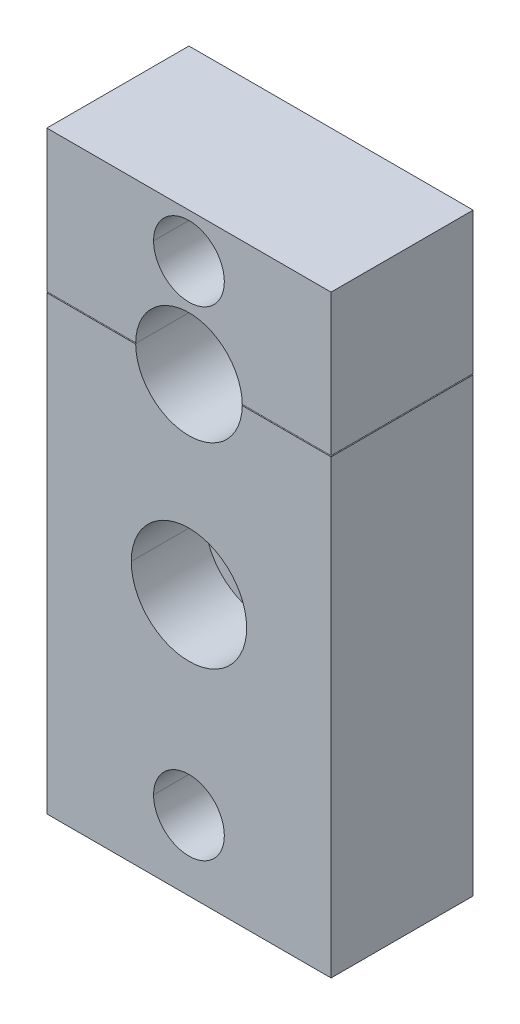
ISO-10303-21;
HEADER;
FILE_DESCRIPTION(('STEP AP214'),'2;1');
FILE_NAME('part.step','',(''),(''),'','','');
FILE_SCHEMA(('AUTOMOTIVE_DESIGN { 1 0 10303 214 1 1 1 1 }'));
ENDSEC;
DATA;
#1=APPLICATION_CONTEXT('core data for automotive mechanical design processes');
#2=APPLICATION_PROTOCOL_DEFINITION('international standard','automotive_design',2000,#1);
#3=PRODUCT_CONTEXT('',#1,'mechanical');
#4=PRODUCT('Part','Part','',(#3));
#5=PRODUCT_RELATED_PRODUCT_CATEGORY('part','',(#4));
#6=PRODUCT_DEFINITION_FORMATION('','',#4);
#7=PRODUCT_DEFINITION_CONTEXT('part definition',#1,'design');
#8=PRODUCT_DEFINITION('design','',#6,#7);
#9=PRODUCT_DEFINITION_SHAPE('','',#8);
#10=(LENGTH_UNIT() NAMED_UNIT(*) SI_UNIT(.MILLI.,.METRE.));
#11=(NAMED_UNIT(*) PLANE_ANGLE_UNIT() SI_UNIT($,.RADIAN.));
#12=(NAMED_UNIT(*) SI_UNIT($,.STERADIAN.) SOLID_ANGLE_UNIT());
#13=UNCERTAINTY_MEASURE_WITH_UNIT(LENGTH_MEASURE(1.E-05),#10,'distance_accuracy_value','');
#14=(GEOMETRIC_REPRESENTATION_CONTEXT(3) GLOBAL_UNCERTAINTY_ASSIGNED_CONTEXT((#13)) GLOBAL_UNIT_ASSIGNED_CONTEXT((#10,
#11,#12)) REPRESENTATION_CONTEXT('',''));
#15=CARTESIAN_POINT('',(0.,0.,0.));
#16=DIRECTION('',(0.,0.,1.));
#17=DIRECTION('',(1.,0.,0.));
#18=AXIS2_PLACEMENT_3D('',#15,#16,#17);
#19=CARTESIAN_POINT('',(-12.7,13.843,6.55));
#20=DIRECTION('',(0.,0.,-1.));
#21=DIRECTION('',(-1.,0.,0.));
#22=AXIS2_PLACEMENT_3D('',#19,#20,#21);
#23=CYLINDRICAL_SURFACE('',#22,0.05);
#24=DIRECTION('',(0.,0.,-1.));
#25=VECTOR('',#24,1.);
#26=CARTESIAN_POINT('',(-12.7,13.893,6.55));
#27=LINE('',#26,#25);
#28=CARTESIAN_POINT('',(-12.7,13.893,6.35));
#29=VERTEX_POINT('',#28);
#30=CARTESIAN_POINT('',(-12.7,13.893,-6.35));
#31=VERTEX_POINT('',#30);
#32=EDGE_CURVE('E250',#29,#31,#27,.T.);
#33=ORIENTED_EDGE('',*,*,#32,.T.);
#34=CARTESIAN_POINT('',(-12.7,13.843,-6.35));
#35=DIRECTION('',(0.,0.,-1.));
#36=DIRECTION('',(1.,0.,0.));
#37=AXIS2_PLACEMENT_3D('',#34,#35,#36);
#38=CIRCLE('',#37,0.05);
#39=CARTESIAN_POINT('',(-12.7,13.793,-6.35));
#40=VERTEX_POINT('',#39);
#41=EDGE_CURVE('E373',#31,#40,#38,.T.);
#42=ORIENTED_EDGE('',*,*,#41,.T.);
#43=DIRECTION('',(0.,0.,1.));
#44=VECTOR('',#43,1.);
#45=CARTESIAN_POINT('',(-12.7,13.793,6.55));
#46=LINE('',#45,#44);
#47=CARTESIAN_POINT('',(-12.7,13.793,6.35));
#48=VERTEX_POINT('',#47);
#49=EDGE_CURVE('E289',#40,#48,#46,.T.);
#50=ORIENTED_EDGE('',*,*,#49,.T.);
#51=CARTESIAN_POINT('',(-12.7,13.793,6.35));
#52=CARTESIAN_POINT('',(-12.6,13.793,6.25));
#53=CARTESIAN_POINT('',(-12.6,13.893,6.24999999999998));
#54=CARTESIAN_POINT('',(-12.7,13.893,6.35));
#55=(BOUNDED_CURVE() B_SPLINE_CURVE(3,(#51,#52,#53,#54),.UNSPECIFIED.,.F.,
.F.) B_SPLINE_CURVE_WITH_KNOTS((4,4),(1.57079632679476,4.71238898038472),
.UNSPECIFIED.) CURVE() GEOMETRIC_REPRESENTATION_ITEM() RATIONAL_B_SPLINE_CURVE((1.,
0.333333333333279,0.333333333333279,1.)) REPRESENTATION_ITEM(''));
#56=EDGE_CURVE('E11',#48,#29,#55,.T.);
#57=ORIENTED_EDGE('',*,*,#56,.T.);
#58=EDGE_LOOP('',(#33,#42,#50,#57));
#59=FACE_BOUND('',#58,.T.);
#60=ADVANCED_FACE('F17',(#59),#23,.F.);
#61=CARTESIAN_POINT('',(12.9,13.843,6.35));
#62=DIRECTION('',(-1.,0.,0.));
#63=DIRECTION('',(0.,0.,1.));
#64=AXIS2_PLACEMENT_3D('',#61,#62,#63);
#65=CYLINDRICAL_SURFACE('',#64,0.05);
#66=DIRECTION('',(-1.,0.,0.));
#67=VECTOR('',#66,1.);
#68=CARTESIAN_POINT('',(12.9,13.893,6.35));
#69=LINE('',#68,#67);
#70=CARTESIAN_POINT('',(-4.76223752557556,13.893,6.35));
#71=VERTEX_POINT('',#70);
#72=EDGE_CURVE('E248',#71,#29,#69,.T.);
#73=ORIENTED_EDGE('',*,*,#72,.T.);
#74=ORIENTED_EDGE('',*,*,#56,.F.);
#75=DIRECTION('',(1.,0.,0.));
#76=VECTOR('',#75,1.);
#77=CARTESIAN_POINT('',(12.9,13.793,6.35));
#78=LINE('',#77,#76);
#79=CARTESIAN_POINT('',(-4.76223752557556,13.793,6.35));
#80=VERTEX_POINT('',#79);
#81=EDGE_CURVE('E413',#48,#80,#78,.T.);
#82=ORIENTED_EDGE('',*,*,#81,.T.);
#83=CARTESIAN_POINT('',(-4.7625,13.843,6.29999999999934));
#84=CARTESIAN_POINT('',(-4.7625,13.8410673815149,6.3));
#85=CARTESIAN_POINT('',(-4.76249881573159,13.8391315226398,6.3001124274826));
#86=CARTESIAN_POINT('',(-4.76249648271598,13.8372118985923,6.30033615115505));
#87=CARTESIAN_POINT('',(-4.7624897274641,13.8316536229086,6.30098394354444));
#88=CARTESIAN_POINT('',(-4.76247277981558,13.8261305508877,6.30260026096365));
#89=CARTESIAN_POINT('',(-4.76244964706003,13.8211000178584,6.30505124270686));
#90=CARTESIAN_POINT('',(-4.76242651383057,13.8160693817709,6.30750227466217));
#91=CARTESIAN_POINT('',(-4.76239674017822,13.811392557673,6.31085559913675));
#92=CARTESIAN_POINT('',(-4.7623673660222,13.8074567721386,6.31483355358881));
#93=CARTESIAN_POINT('',(-4.76233799045437,13.8035207974399,6.31881169923187));
#94=CARTESIAN_POINT('',(-4.76230843651631,13.8002173735997,6.32352426084991));
#95=CARTESIAN_POINT('',(-4.76228569312069,13.7978200586767,6.328581015383));
#96=CARTESIAN_POINT('',(-4.76226294971097,13.7954227422672,6.33363777305143));
#97=CARTESIAN_POINT('',(-4.76224656952833,13.793865417505,6.33917820686494));
#98=CARTESIAN_POINT('',(-4.76224042662771,13.793277077794,6.34474347954435));
#99=CARTESIAN_POINT('',(-4.76223850064186,13.7930926154323,6.34648836149419));
#100=CARTESIAN_POINT('',(-4.76223752557556,13.793,6.34824539375038));
#101=CARTESIAN_POINT('',(-4.76223752557556,13.793,6.35));
#102=(BOUNDED_CURVE() B_SPLINE_CURVE(3,(#83,#84,#85,#86,#87,#88,#89,#90,#91,#92,#93,#94,#95,#96,
#97,#98,#99,#100,#101),.UNSPECIFIED.,.F.,.F.) B_SPLINE_CURVE_WITH_KNOTS((4,3,3,3,3,3,4),
(7.81796662597719E-05,8.39420516044303E-05,0.000100729739900136,0.000117517765808179,
0.000134306622351156,0.000151095506051008,0.000156291814714952),
.UNSPECIFIED.) CURVE() GEOMETRIC_REPRESENTATION_ITEM() RATIONAL_B_SPLINE_CURVE((1.,1.,1.,1.,1.,
1.,1.,1.,1.,1.,1.,1.,1.,1.,1.,1.,1.,1.,1.)) REPRESENTATION_ITEM(''));
#103=CARTESIAN_POINT('',(-4.7625,13.843,6.29999999999934));
#104=VERTEX_POINT('',#103);
#105=EDGE_CURVE('E261',#104,#80,#102,.T.);
#106=ORIENTED_EDGE('',*,*,#105,.F.);
#107=CARTESIAN_POINT('',(-4.76223752557556,13.893,6.35));
#108=CARTESIAN_POINT('',(-4.76223752557556,13.893,6.34440398215821));
#109=CARTESIAN_POINT('',(-4.76224793150338,13.8920338662718,6.33873079251392));
#110=CARTESIAN_POINT('',(-4.76226628241778,13.8901816208578,6.33345023706435));
#111=CARTESIAN_POINT('',(-4.76228463330767,13.8883293779164,6.32816968866389));
#112=CARTESIAN_POINT('',(-4.76231129003556,13.8855399466715,6.32313613118116));
#113=CARTESIAN_POINT('',(-4.76233994917155,13.8820443148832,6.31876634066749));
#114=CARTESIAN_POINT('',(-4.76236860930038,13.878548561996,6.31439639877145));
#115=CARTESIAN_POINT('',(-4.76239983577901,13.874250143666,6.31056974099439));
#116=CARTESIAN_POINT('',(-4.76242624470034,13.8695049766906,6.30760322877115));
#117=CARTESIAN_POINT('',(-4.76245265421694,13.864759702759,6.30463664968267));
#118=CARTESIAN_POINT('',(-4.7624747655029,13.8594367688744,6.30244843447114));
#119=CARTESIAN_POINT('',(-4.76248734967871,13.8539769827473,6.30121982113844));
#120=CARTESIAN_POINT('',(-4.76249562811937,13.8503852882131,6.30041158365644));
#121=CARTESIAN_POINT('',(-4.7625,13.8466815195213,6.3));
#122=CARTESIAN_POINT('',(-4.7625,13.843,6.29999999999934));
#123=(BOUNDED_CURVE() B_SPLINE_CURVE(3,(#107,#108,#109,#110,#111,#112,#113,#114,#115,#116,#117,
#118,#119,#120,#121,#122),.UNSPECIFIED.,.F.,.F.) B_SPLINE_CURVE_WITH_KNOTS((4,3,3,3,3,4),(0.,
1.67880535253847E-05,3.35760676220725E-05,5.03646729851543E-05,6.71536809521876E-05,
7.81796662597719E-05),
.UNSPECIFIED.) CURVE() GEOMETRIC_REPRESENTATION_ITEM() RATIONAL_B_SPLINE_CURVE((1.,1.,1.,1.,1.,
1.,1.,1.,1.,1.,1.,1.,1.,1.,1.,1.)) REPRESENTATION_ITEM(''));
#124=EDGE_CURVE('E405',#71,#104,#123,.T.);
#125=ORIENTED_EDGE('',*,*,#124,.F.);
#126=EDGE_LOOP('',(#73,#74,#82,#106,#125));
#127=FACE_BOUND('',#126,.T.);
#128=ADVANCED_FACE('F699',(#127),#65,.F.);
#129=CARTESIAN_POINT('',(12.7,13.843,-10.0835238046649));
#130=DIRECTION('',(0.,0.,1.));
#131=DIRECTION('',(1.,0.,0.));
#132=AXIS2_PLACEMENT_3D('',#129,#130,#131);
#133=CYLINDRICAL_SURFACE('',#132,0.05);
#134=DIRECTION('',(0.,0.,1.));
#135=VECTOR('',#134,1.);
#136=CARTESIAN_POINT('',(12.7,13.893,-10.0835238046649));
#137=LINE('',#136,#135);
#138=CARTESIAN_POINT('',(12.7,13.893,-6.35));
#139=VERTEX_POINT('',#138);
#140=CARTESIAN_POINT('',(12.7,13.893,6.35));
#141=VERTEX_POINT('',#140);
#142=EDGE_CURVE('E329',#139,#141,#137,.T.);
#143=ORIENTED_EDGE('',*,*,#142,.T.);
#144=CARTESIAN_POINT('',(12.7,13.793,6.35));
#145=CARTESIAN_POINT('',(12.6,13.793,6.24999999999999));
#146=CARTESIAN_POINT('',(12.6,13.893,6.24999999999999));
#147=CARTESIAN_POINT('',(12.7,13.893,6.35));
#148=(BOUNDED_CURVE() B_SPLINE_CURVE(3,(#144,#145,#146,#147),.UNSPECIFIED.,.F.,
.F.) B_SPLINE_CURVE_WITH_KNOTS((4,4),(1.57079632679483,4.71238898038476),
.UNSPECIFIED.) CURVE() GEOMETRIC_REPRESENTATION_ITEM() RATIONAL_B_SPLINE_CURVE((1.,
0.333333333333287,0.333333333333287,1.)) REPRESENTATION_ITEM(''));
#149=CARTESIAN_POINT('',(12.7,13.793,6.35));
#150=VERTEX_POINT('',#149);
#151=EDGE_CURVE('E21',#150,#141,#148,.T.);
#152=ORIENTED_EDGE('',*,*,#151,.F.);
#153=DIRECTION('',(0.,0.,-1.));
#154=VECTOR('',#153,1.);
#155=CARTESIAN_POINT('',(12.7,13.793,-10.0835238046649));
#156=LINE('',#155,#154);
#157=CARTESIAN_POINT('',(12.7,13.793,-6.35));
#158=VERTEX_POINT('',#157);
#159=EDGE_CURVE('E366',#150,#158,#156,.T.);
#160=ORIENTED_EDGE('',*,*,#159,.T.);
#161=CARTESIAN_POINT('',(12.7,13.843,-6.35));
#162=DIRECTION('',(0.,0.,-1.));
#163=DIRECTION('',(1.,0.,0.));
#164=AXIS2_PLACEMENT_3D('',#161,#162,#163);
#165=CIRCLE('',#164,0.05);
#166=EDGE_CURVE('E351',#158,#139,#165,.T.);
#167=ORIENTED_EDGE('',*,*,#166,.T.);
#168=EDGE_LOOP('',(#143,#152,#160,#167));
#169=FACE_BOUND('',#168,.T.);
#170=ADVANCED_FACE('F19',(#169),#133,.F.);
#171=CARTESIAN_POINT('',(12.9,13.843,6.35));
#172=DIRECTION('',(-1.,0.,0.));
#173=DIRECTION('',(0.,0.,1.));
#174=AXIS2_PLACEMENT_3D('',#171,#172,#173);
#175=CYLINDRICAL_SURFACE('',#174,0.05);
#176=DIRECTION('',(-1.,0.,0.));
#177=VECTOR('',#176,1.);
#178=CARTESIAN_POINT('',(12.9,13.893,6.35));
#179=LINE('',#178,#177);
#180=CARTESIAN_POINT('',(4.76223752557556,13.893,6.35));
#181=VERTEX_POINT('',#180);
#182=EDGE_CURVE('E249',#141,#181,#179,.T.);
#183=ORIENTED_EDGE('',*,*,#182,.T.);
#184=CARTESIAN_POINT('',(4.7625,13.843,6.29999999999933));
#185=CARTESIAN_POINT('',(4.7625,13.844932618485,6.3));
#186=CARTESIAN_POINT('',(4.7624988157316,13.8468684773602,6.3001124274826));
#187=CARTESIAN_POINT('',(4.76249648271599,13.8487881014077,6.30033615115505));
#188=CARTESIAN_POINT('',(4.76248972746411,13.8543463770914,6.30098394354443));
#189=CARTESIAN_POINT('',(4.76247277981558,13.8598694491122,6.30260026096365));
#190=CARTESIAN_POINT('',(4.76244964706003,13.8648999821416,6.30505124270686));
#191=CARTESIAN_POINT('',(4.76242651383058,13.8699306182291,6.30750227466217));
#192=CARTESIAN_POINT('',(4.76239674017823,13.874607442327,6.31085559913675));
#193=CARTESIAN_POINT('',(4.7623673660222,13.8785432278614,6.31483355358881));
#194=CARTESIAN_POINT('',(4.76233799045437,13.8824792025601,6.31881169923187));
#195=CARTESIAN_POINT('',(4.76230843651631,13.8857826264002,6.32352426084991));
#196=CARTESIAN_POINT('',(4.76228569312069,13.8881799413233,6.328581015383));
#197=CARTESIAN_POINT('',(4.76226294971098,13.8905772577327,6.33363777305143));
#198=CARTESIAN_POINT('',(4.76224656952834,13.8921345824949,6.33917820686494));
#199=CARTESIAN_POINT('',(4.76224042662772,13.8927229222059,6.34474347954434));
#200=CARTESIAN_POINT('',(4.76223850064187,13.8929073845677,6.34648836149419));
#201=CARTESIAN_POINT('',(4.76223752557556,13.893,6.34824539375038));
#202=CARTESIAN_POINT('',(4.76223752557556,13.893,6.35));
#203=(BOUNDED_CURVE() B_SPLINE_CURVE(3,(#184,#185,#186,#187,#188,#189,#190,#191,#192,#193,#194,
#195,#196,#197,#198,#199,#200,#201,#202),.UNSPECIFIED.,.F.,.F.) B_SPLINE_CURVE_WITH_KNOTS((4,3,
3,3,3,3,4),(7.81796662597715E-05,8.39420516044299E-05,0.000100729739900138,0.000117517765808179,
0.000134306622351158,0.000151095506051009,0.000156291814714951),
.UNSPECIFIED.) CURVE() GEOMETRIC_REPRESENTATION_ITEM() RATIONAL_B_SPLINE_CURVE((1.,1.,1.,1.,1.,
1.,1.,1.,1.,1.,1.,1.,1.,1.,1.,1.,1.,1.,1.)) REPRESENTATION_ITEM(''));
#204=CARTESIAN_POINT('',(4.7625,13.843,6.29999999999933));
#205=VERTEX_POINT('',#204);
#206=EDGE_CURVE('E395',#205,#181,#203,.T.);
#207=ORIENTED_EDGE('',*,*,#206,.F.);
#208=CARTESIAN_POINT('',(4.76223752557556,13.793,6.35));
#209=CARTESIAN_POINT('',(4.76223752557556,13.793,6.3444039821582));
#210=CARTESIAN_POINT('',(4.76224793150339,13.7939661337281,6.33873079251391));
#211=CARTESIAN_POINT('',(4.76226628241778,13.7958183791421,6.33345023706435));
#212=CARTESIAN_POINT('',(4.76228463330768,13.7976706220835,6.32816968866388));
#213=CARTESIAN_POINT('',(4.76231129003556,13.8004600533285,6.32313613118115));
#214=CARTESIAN_POINT('',(4.76233994917156,13.8039556851168,6.31876634066749));
#215=CARTESIAN_POINT('',(4.76236860930039,13.807451438004,6.31439639877145));
#216=CARTESIAN_POINT('',(4.76239983577901,13.811749856334,6.31056974099439));
#217=CARTESIAN_POINT('',(4.76242624470035,13.8164950233094,6.30760322877115));
#218=CARTESIAN_POINT('',(4.76245265421695,13.821240297241,6.30463664968267));
#219=CARTESIAN_POINT('',(4.7624747655029,13.8265632311256,6.30244843447114));
#220=CARTESIAN_POINT('',(4.76248734967872,13.8320230172527,6.30121982113844));
#221=CARTESIAN_POINT('',(4.76249562811938,13.8356147117868,6.30041158365644));
#222=CARTESIAN_POINT('',(4.7625,13.8393184804787,6.3));
#223=CARTESIAN_POINT('',(4.7625,13.843,6.29999999999933));
#224=(BOUNDED_CURVE() B_SPLINE_CURVE(3,(#208,#209,#210,#211,#212,#213,#214,#215,#216,#217,#218,
#219,#220,#221,#222,#223),.UNSPECIFIED.,.F.,.F.) B_SPLINE_CURVE_WITH_KNOTS((4,3,3,3,3,4),(0.,
1.67880535253847E-05,3.35760676220731E-05,5.03646729851556E-05,6.71536809521871E-05,
7.81796662597715E-05),
.UNSPECIFIED.) CURVE() GEOMETRIC_REPRESENTATION_ITEM() RATIONAL_B_SPLINE_CURVE((1.,1.,1.,1.,1.,
1.,1.,1.,1.,1.,1.,1.,1.,1.,1.,1.)) REPRESENTATION_ITEM(''));
#225=CARTESIAN_POINT('',(4.76223752557556,13.793,6.35));
#226=VERTEX_POINT('',#225);
#227=EDGE_CURVE('E260',#226,#205,#224,.T.);
#228=ORIENTED_EDGE('',*,*,#227,.F.);
#229=DIRECTION('',(1.,0.,0.));
#230=VECTOR('',#229,1.);
#231=CARTESIAN_POINT('',(12.9,13.793,6.35));
#232=LINE('',#231,#230);
#233=EDGE_CURVE('E400',#226,#150,#232,.T.);
#234=ORIENTED_EDGE('',*,*,#233,.T.);
#235=ORIENTED_EDGE('',*,*,#151,.T.);
#236=EDGE_LOOP('',(#183,#207,#228,#234,#235));
#237=FACE_BOUND('',#236,.T.);
#238=ADVANCED_FACE('F430',(#237),#175,.F.);
#239=CARTESIAN_POINT('',(0.,-3.2258,-0.254));
#240=DIRECTION('',(0.,0.,1.));
#241=DIRECTION('',(1.,0.,0.));
#242=AXIS2_PLACEMENT_3D('',#239,#240,#241);
#243=CYLINDRICAL_SURFACE('',#242,5.1562);
#244=DIRECTION('',(0.,0.,1.));
#245=VECTOR('',#244,1.);
#246=CARTESIAN_POINT('',(-5.1562,-3.2258,-0.254));
#247=LINE('',#246,#245);
#248=CARTESIAN_POINT('',(-5.1562,-3.2258,-0.254));
#249=VERTEX_POINT('',#248);
#250=CARTESIAN_POINT('',(-5.1562,-3.2258,6.35));
#251=VERTEX_POINT('',#250);
#252=EDGE_CURVE('E1146',#249,#251,#247,.T.);
#253=ORIENTED_EDGE('',*,*,#252,.F.);
#254=CARTESIAN_POINT('',(0.,-3.2258,-0.254));
#255=DIRECTION('',(0.,0.,1.));
#256=DIRECTION('',(1.,0.,0.));
#257=AXIS2_PLACEMENT_3D('',#254,#255,#256);
#258=CIRCLE('',#257,5.1562);
#259=CARTESIAN_POINT('',(5.1562,-3.2258,-0.254));
#260=VERTEX_POINT('',#259);
#261=EDGE_CURVE('E399',#260,#249,#258,.T.);
#262=ORIENTED_EDGE('',*,*,#261,.F.);
#263=DIRECTION('',(0.,0.,1.));
#264=VECTOR('',#263,1.);
#265=CARTESIAN_POINT('',(5.1562,-3.2258,-0.254));
#266=LINE('',#265,#264);
#267=CARTESIAN_POINT('',(5.1562,-3.2258,6.35));
#268=VERTEX_POINT('',#267);
#269=EDGE_CURVE('E452',#260,#268,#266,.T.);
#270=ORIENTED_EDGE('',*,*,#269,.T.);
#271=CARTESIAN_POINT('',(0.,-3.2258,6.35));
#272=DIRECTION('',(0.,0.,1.));
#273=DIRECTION('',(1.,0.,0.));
#274=AXIS2_PLACEMENT_3D('',#271,#272,#273);
#275=CIRCLE('',#274,5.1562);
#276=EDGE_CURVE('E396',#268,#251,#275,.T.);
#277=ORIENTED_EDGE('',*,*,#276,.T.);
#278=EDGE_LOOP('',(#253,#262,#270,#277));
#279=FACE_BOUND('',#278,.T.);
#280=ADVANCED_FACE('F854',(#279),#243,.F.);
#281=CARTESIAN_POINT('',(0.,-3.2258,-0.254));
#282=DIRECTION('',(0.,0.,1.));
#283=DIRECTION('',(1.,0.,0.));
#284=AXIS2_PLACEMENT_3D('',#281,#282,#283);
#285=PLANE('',#284);
#286=CARTESIAN_POINT('',(0.,-3.2258,-0.254));
#287=DIRECTION('',(0.,0.,-1.));
#288=DIRECTION('',(1.,0.,0.));
#289=AXIS2_PLACEMENT_3D('',#286,#287,#288);
#290=CIRCLE('',#289,3.2639);
#291=CARTESIAN_POINT('',(3.2639,-3.2258,-0.254));
#292=VERTEX_POINT('',#291);
#293=CARTESIAN_POINT('',(-3.2639,-3.2258,-0.254));
#294=VERTEX_POINT('',#293);
#295=EDGE_CURVE('E312',#292,#294,#290,.T.);
#296=ORIENTED_EDGE('',*,*,#295,.T.);
#297=CARTESIAN_POINT('',(0.,-3.2258,-0.254));
#298=DIRECTION('',(0.,0.,-1.));
#299=DIRECTION('',(1.,0.,0.));
#300=AXIS2_PLACEMENT_3D('',#297,#298,#299);
#301=CIRCLE('',#300,3.2639);
#302=EDGE_CURVE('E293',#294,#292,#301,.T.);
#303=ORIENTED_EDGE('',*,*,#302,.T.);
#304=EDGE_LOOP('',(#296,#303));
#305=FACE_BOUND('',#304,.T.);
#306=ORIENTED_EDGE('',*,*,#261,.T.);
#307=CARTESIAN_POINT('',(0.,-3.2258,-0.254));
#308=DIRECTION('',(0.,0.,1.));
#309=DIRECTION('',(1.,0.,0.));
#310=AXIS2_PLACEMENT_3D('',#307,#308,#309);
#311=CIRCLE('',#310,5.1562);
#312=EDGE_CURVE('E1154',#249,#260,#311,.T.);
#313=ORIENTED_EDGE('',*,*,#312,.T.);
#314=EDGE_LOOP('',(#306,#313));
#315=FACE_BOUND('',#314,.T.);
#316=ADVANCED_FACE('F845',(#305,#315),#285,.T.);
#317=CARTESIAN_POINT('',(0.,0.,6.35));
#318=DIRECTION('',(0.,0.,1.));
#319=DIRECTION('',(1.,0.,0.));
#320=AXIS2_PLACEMENT_3D('',#317,#318,#319);
#321=PLANE('',#320);
#322=CARTESIAN_POINT('',(0.,-20.2946,6.35));
#323=DIRECTION('',(0.,0.,1.));
#324=DIRECTION('',(1.,0.,0.));
#325=AXIS2_PLACEMENT_3D('',#322,#323,#324);
#326=CIRCLE('',#325,3.1623);
#327=CARTESIAN_POINT('',(3.1623,-20.2946,6.35));
#328=VERTEX_POINT('',#327);
#329=CARTESIAN_POINT('',(-3.1623,-20.2946,6.35));
#330=VERTEX_POINT('',#329);
#331=EDGE_CURVE('E392',#328,#330,#326,.T.);
#332=ORIENTED_EDGE('',*,*,#331,.F.);
#333=CARTESIAN_POINT('',(0.,-20.2946,6.35));
#334=DIRECTION('',(0.,0.,1.));
#335=DIRECTION('',(1.,0.,0.));
#336=AXIS2_PLACEMENT_3D('',#333,#334,#335);
#337=CIRCLE('',#336,3.1623);
#338=EDGE_CURVE('E288',#330,#328,#337,.T.);
#339=ORIENTED_EDGE('',*,*,#338,.F.);
#340=EDGE_LOOP('',(#332,#339));
#341=FACE_BOUND('',#340,.T.);
#342=ORIENTED_EDGE('',*,*,#276,.F.);
#343=CARTESIAN_POINT('',(0.,-3.2258,6.35));
#344=DIRECTION('',(0.,0.,1.));
#345=DIRECTION('',(1.,0.,0.));
#346=AXIS2_PLACEMENT_3D('',#343,#344,#345);
#347=CIRCLE('',#346,5.1562);
#348=EDGE_CURVE('E1153',#251,#268,#347,.T.);
#349=ORIENTED_EDGE('',*,*,#348,.F.);
#350=EDGE_LOOP('',(#342,#349));
#351=FACE_BOUND('',#350,.T.);
#352=ORIENTED_EDGE('',*,*,#81,.F.);
#353=DIRECTION('',(0.,-1.,0.));
#354=VECTOR('',#353,1.);
#355=CARTESIAN_POINT('',(-12.7,26.543,6.35));
#356=LINE('',#355,#354);
#357=CARTESIAN_POINT('',(-12.7,-26.543,6.35));
#358=VERTEX_POINT('',#357);
#359=EDGE_CURVE('E360',#48,#358,#356,.T.);
#360=ORIENTED_EDGE('',*,*,#359,.T.);
#361=DIRECTION('',(1.,0.,0.));
#362=VECTOR('',#361,1.);
#363=CARTESIAN_POINT('',(-12.7,-26.543,6.35));
#364=LINE('',#363,#362);
#365=CARTESIAN_POINT('',(12.7,-26.543,6.35));
#366=VERTEX_POINT('',#365);
#367=EDGE_CURVE('E53',#358,#366,#364,.T.);
#368=ORIENTED_EDGE('',*,*,#367,.T.);
#369=DIRECTION('',(0.,1.,0.));
#370=VECTOR('',#369,1.);
#371=CARTESIAN_POINT('',(12.7,26.543,6.35));
#372=LINE('',#371,#370);
#373=EDGE_CURVE('E370',#366,#150,#372,.T.);
#374=ORIENTED_EDGE('',*,*,#373,.T.);
#375=ORIENTED_EDGE('',*,*,#233,.F.);
#376=CARTESIAN_POINT('',(0.,13.843,6.35));
#377=DIRECTION('',(0.,0.,1.));
#378=DIRECTION('',(1.,0.,0.));
#379=AXIS2_PLACEMENT_3D('',#376,#377,#378);
#380=CIRCLE('',#379,4.7625);
#381=EDGE_CURVE('E256',#80,#226,#380,.T.);
#382=ORIENTED_EDGE('',*,*,#381,.F.);
#383=EDGE_LOOP('',(#352,#360,#368,#374,#375,#382));
#384=FACE_BOUND('',#383,.T.);
#385=ADVANCED_FACE('F837',(#341,#351,#384),#321,.T.);
#386=CARTESIAN_POINT('',(0.,22.5806,-6.35));
#387=DIRECTION('',(0.,0.,1.));
#388=DIRECTION('',(1.,0.,0.));
#389=AXIS2_PLACEMENT_3D('',#386,#387,#388);
#390=CYLINDRICAL_SURFACE('',#389,3.1623);
#391=DIRECTION('',(0.,0.,1.));
#392=VECTOR('',#391,1.);
#393=CARTESIAN_POINT('',(-3.1623,22.5806,-6.35));
#394=LINE('',#393,#392);
#395=CARTESIAN_POINT('',(-3.1623,22.5806,-6.35));
#396=VERTEX_POINT('',#395);
#397=CARTESIAN_POINT('',(-3.1623,22.5806,6.35));
#398=VERTEX_POINT('',#397);
#399=EDGE_CURVE('E230',#396,#398,#394,.T.);
#400=ORIENTED_EDGE('',*,*,#399,.F.);
#401=CARTESIAN_POINT('',(0.,22.5806,-6.35));
#402=DIRECTION('',(0.,0.,1.));
#403=DIRECTION('',(1.,0.,0.));
#404=AXIS2_PLACEMENT_3D('',#401,#402,#403);
#405=CIRCLE('',#404,3.1623);
#406=CARTESIAN_POINT('',(3.1623,22.5806,-6.35));
#407=VERTEX_POINT('',#406);
#408=EDGE_CURVE('E222',#407,#396,#405,.T.);
#409=ORIENTED_EDGE('',*,*,#408,.F.);
#410=DIRECTION('',(0.,0.,1.));
#411=VECTOR('',#410,1.);
#412=CARTESIAN_POINT('',(3.1623,22.5806,-6.35));
#413=LINE('',#412,#411);
#414=CARTESIAN_POINT('',(3.1623,22.5806,6.35));
#415=VERTEX_POINT('',#414);
#416=EDGE_CURVE('E220',#407,#415,#413,.T.);
#417=ORIENTED_EDGE('',*,*,#416,.T.);
#418=CARTESIAN_POINT('',(0.,22.5806,6.35));
#419=DIRECTION('',(0.,0.,1.));
#420=DIRECTION('',(1.,0.,0.));
#421=AXIS2_PLACEMENT_3D('',#418,#419,#420);
#422=CIRCLE('',#421,3.1623);
#423=EDGE_CURVE('E206',#415,#398,#422,.T.);
#424=ORIENTED_EDGE('',*,*,#423,.T.);
#425=EDGE_LOOP('',(#400,#409,#417,#424));
#426=FACE_BOUND('',#425,.T.);
#427=ADVANCED_FACE('F221',(#426),#390,.F.);
#428=CARTESIAN_POINT('',(0.,13.843,-6.35));
#429=DIRECTION('',(0.,0.,1.));
#430=DIRECTION('',(1.,0.,0.));
#431=AXIS2_PLACEMENT_3D('',#428,#429,#430);
#432=CYLINDRICAL_SURFACE('',#431,4.7625);
#433=DIRECTION('',(0.,0.,1.));
#434=VECTOR('',#433,1.);
#435=CARTESIAN_POINT('',(-4.7625,13.843,-6.35));
#436=LINE('',#435,#434);
#437=CARTESIAN_POINT('',(-4.7625,13.843,-6.35));
#438=VERTEX_POINT('',#437);
#439=EDGE_CURVE('E243',#438,#104,#436,.T.);
#440=ORIENTED_EDGE('',*,*,#439,.F.);
#441=CARTESIAN_POINT('',(0.,13.843,-6.35));
#442=DIRECTION('',(0.,0.,1.));
#443=DIRECTION('',(1.,0.,0.));
#444=AXIS2_PLACEMENT_3D('',#441,#442,#443);
#445=CIRCLE('',#444,4.7625);
#446=CARTESIAN_POINT('',(4.7625,13.843,-6.35));
#447=VERTEX_POINT('',#446);
#448=EDGE_CURVE('E350',#447,#438,#445,.T.);
#449=ORIENTED_EDGE('',*,*,#448,.F.);
#450=DIRECTION('',(0.,0.,1.));
#451=VECTOR('',#450,1.);
#452=CARTESIAN_POINT('',(4.7625,13.843,-6.35));
#453=LINE('',#452,#451);
#454=EDGE_CURVE('E267',#447,#205,#453,.T.);
#455=ORIENTED_EDGE('',*,*,#454,.T.);
#456=ORIENTED_EDGE('',*,*,#206,.T.);
#457=CARTESIAN_POINT('',(0.,13.843,6.35));
#458=DIRECTION('',(0.,0.,1.));
#459=DIRECTION('',(1.,0.,0.));
#460=AXIS2_PLACEMENT_3D('',#457,#458,#459);
#461=CIRCLE('',#460,4.7625);
#462=EDGE_CURVE('E217',#181,#71,#461,.T.);
#463=ORIENTED_EDGE('',*,*,#462,.T.);
#464=ORIENTED_EDGE('',*,*,#124,.T.);
#465=EDGE_LOOP('',(#440,#449,#455,#456,#463,#464));
#466=FACE_BOUND('',#465,.T.);
#467=ADVANCED_FACE('F820',(#466),#432,.F.);
#468=CARTESIAN_POINT('',(0.,-20.2946,-6.35));
#469=DIRECTION('',(0.,0.,1.));
#470=DIRECTION('',(1.,0.,0.));
#471=AXIS2_PLACEMENT_3D('',#468,#469,#470);
#472=CYLINDRICAL_SURFACE('',#471,3.1623);
#473=DIRECTION('',(0.,0.,1.));
#474=VECTOR('',#473,1.);
#475=CARTESIAN_POINT('',(-3.1623,-20.2946,-6.35));
#476=LINE('',#475,#474);
#477=CARTESIAN_POINT('',(-3.1623,-20.2946,-6.35));
#478=VERTEX_POINT('',#477);
#479=EDGE_CURVE('E278',#478,#330,#476,.T.);
#480=ORIENTED_EDGE('',*,*,#479,.F.);
#481=CARTESIAN_POINT('',(0.,-20.2946,-6.35));
#482=DIRECTION('',(0.,0.,1.));
#483=DIRECTION('',(1.,0.,0.));
#484=AXIS2_PLACEMENT_3D('',#481,#482,#483);
#485=CIRCLE('',#484,3.1623);
#486=CARTESIAN_POINT('',(3.1623,-20.2946,-6.35));
#487=VERTEX_POINT('',#486);
#488=EDGE_CURVE('E389',#487,#478,#485,.T.);
#489=ORIENTED_EDGE('',*,*,#488,.F.);
#490=DIRECTION('',(0.,0.,1.));
#491=VECTOR('',#490,1.);
#492=CARTESIAN_POINT('',(3.1623,-20.2946,-6.35));
#493=LINE('',#492,#491);
#494=EDGE_CURVE('E300',#487,#328,#493,.T.);
#495=ORIENTED_EDGE('',*,*,#494,.T.);
#496=ORIENTED_EDGE('',*,*,#331,.T.);
#497=EDGE_LOOP('',(#480,#489,#495,#496));
#498=FACE_BOUND('',#497,.T.);
#499=ADVANCED_FACE('F787',(#498),#472,.F.);
#500=CARTESIAN_POINT('',(0.,0.,-6.35));
#501=DIRECTION('',(0.,0.,1.));
#502=DIRECTION('',(1.,0.,0.));
#503=AXIS2_PLACEMENT_3D('',#500,#501,#502);
#504=PLANE('',#503);
#505=ORIENTED_EDGE('',*,*,#488,.T.);
#506=CARTESIAN_POINT('',(0.,-20.2946,-6.35));
#507=DIRECTION('',(0.,0.,1.));
#508=DIRECTION('',(1.,0.,0.));
#509=AXIS2_PLACEMENT_3D('',#506,#507,#508);
#510=CIRCLE('',#509,3.1623);
#511=EDGE_CURVE('E274',#478,#487,#510,.T.);
#512=ORIENTED_EDGE('',*,*,#511,.T.);
#513=EDGE_LOOP('',(#505,#512));
#514=FACE_BOUND('',#513,.T.);
#515=CARTESIAN_POINT('',(0.,-3.2258,-6.35));
#516=DIRECTION('',(0.,0.,1.));
#517=DIRECTION('',(1.,0.,0.));
#518=AXIS2_PLACEMENT_3D('',#515,#516,#517);
#519=CIRCLE('',#518,3.2639);
#520=CARTESIAN_POINT('',(3.2639,-3.2258,-6.35));
#521=VERTEX_POINT('',#520);
#522=CARTESIAN_POINT('',(-3.2639,-3.2258,-6.35));
#523=VERTEX_POINT('',#522);
#524=EDGE_CURVE('E216',#521,#523,#519,.T.);
#525=ORIENTED_EDGE('',*,*,#524,.T.);
#526=CARTESIAN_POINT('',(0.,-3.2258,-6.35));
#527=DIRECTION('',(0.,0.,1.));
#528=DIRECTION('',(1.,0.,0.));
#529=AXIS2_PLACEMENT_3D('',#526,#527,#528);
#530=CIRCLE('',#529,3.2639);
#531=EDGE_CURVE('E304',#523,#521,#530,.T.);
#532=ORIENTED_EDGE('',*,*,#531,.T.);
#533=EDGE_LOOP('',(#525,#532));
#534=FACE_BOUND('',#533,.T.);
#535=ORIENTED_EDGE('',*,*,#448,.T.);
#536=CARTESIAN_POINT('',(0.,13.843,-6.35));
#537=DIRECTION('',(0.,0.,1.));
#538=DIRECTION('',(1.,0.,0.));
#539=AXIS2_PLACEMENT_3D('',#536,#537,#538);
#540=CIRCLE('',#539,4.7625);
#541=EDGE_CURVE('E227',#438,#447,#540,.T.);
#542=ORIENTED_EDGE('',*,*,#541,.T.);
#543=EDGE_LOOP('',(#535,#542));
#544=FACE_BOUND('',#543,.T.);
#545=ORIENTED_EDGE('',*,*,#408,.T.);
#546=CARTESIAN_POINT('',(0.,22.5806,-6.35));
#547=DIRECTION('',(0.,0.,1.));
#548=DIRECTION('',(1.,0.,0.));
#549=AXIS2_PLACEMENT_3D('',#546,#547,#548);
#550=CIRCLE('',#549,3.1623);
#551=EDGE_CURVE('E236',#396,#407,#550,.T.);
#552=ORIENTED_EDGE('',*,*,#551,.T.);
#553=EDGE_LOOP('',(#545,#552));
#554=FACE_BOUND('',#553,.T.);
#555=DIRECTION('',(0.,-1.,0.));
#556=VECTOR('',#555,1.);
#557=CARTESIAN_POINT('',(-12.7,26.543,-6.35));
#558=LINE('',#557,#556);
#559=CARTESIAN_POINT('',(-12.7,-26.543,-6.35));
#560=VERTEX_POINT('',#559);
#561=EDGE_CURVE('E240',#40,#560,#558,.T.);
#562=ORIENTED_EDGE('',*,*,#561,.F.);
#563=ORIENTED_EDGE('',*,*,#41,.F.);
#564=DIRECTION('',(0.,-1.,0.));
#565=VECTOR('',#564,1.);
#566=CARTESIAN_POINT('',(-12.7,26.543,-6.35));
#567=LINE('',#566,#565);
#568=CARTESIAN_POINT('',(-12.7,26.543,-6.35));
#569=VERTEX_POINT('',#568);
#570=EDGE_CURVE('E326',#569,#31,#567,.T.);
#571=ORIENTED_EDGE('',*,*,#570,.F.);
#572=DIRECTION('',(-1.,0.,0.));
#573=VECTOR('',#572,1.);
#574=CARTESIAN_POINT('',(-12.7,26.543,-6.35));
#575=LINE('',#574,#573);
#576=CARTESIAN_POINT('',(12.7,26.543,-6.35));
#577=VERTEX_POINT('',#576);
#578=EDGE_CURVE('E363',#577,#569,#575,.T.);
#579=ORIENTED_EDGE('',*,*,#578,.F.);
#580=DIRECTION('',(0.,1.,0.));
#581=VECTOR('',#580,1.);
#582=CARTESIAN_POINT('',(12.7,26.543,-6.35));
#583=LINE('',#582,#581);
#584=EDGE_CURVE('E284',#139,#577,#583,.T.);
#585=ORIENTED_EDGE('',*,*,#584,.F.);
#586=ORIENTED_EDGE('',*,*,#166,.F.);
#587=DIRECTION('',(0.,1.,0.));
#588=VECTOR('',#587,1.);
#589=CARTESIAN_POINT('',(12.7,26.543,-6.35));
#590=LINE('',#589,#588);
#591=CARTESIAN_POINT('',(12.7,-26.543,-6.35));
#592=VERTEX_POINT('',#591);
#593=EDGE_CURVE('E379',#592,#158,#590,.T.);
#594=ORIENTED_EDGE('',*,*,#593,.F.);
#595=DIRECTION('',(1.,0.,0.));
#596=VECTOR('',#595,1.);
#597=CARTESIAN_POINT('',(-12.7,-26.543,-6.35));
#598=LINE('',#597,#596);
#599=EDGE_CURVE('E42',#560,#592,#598,.T.);
#600=ORIENTED_EDGE('',*,*,#599,.F.);
#601=EDGE_LOOP('',(#562,#563,#571,#579,#585,#586,#594,#600));
#602=FACE_BOUND('',#601,.T.);
#603=ADVANCED_FACE('F445',(#514,#534,#544,#554,#602),#504,.F.);
#604=CARTESIAN_POINT('',(-12.7,-26.543,-6.35));
#605=DIRECTION('',(0.,-1.,0.));
#606=DIRECTION('',(0.,0.,-1.));
#607=AXIS2_PLACEMENT_3D('',#604,#605,#606);
#608=PLANE('',#607);
#609=DIRECTION('',(0.,0.,1.));
#610=VECTOR('',#609,1.);
#611=CARTESIAN_POINT('',(12.7,-26.543,-6.35));
#612=LINE('',#611,#610);
#613=EDGE_CURVE('E376',#592,#366,#612,.T.);
#614=ORIENTED_EDGE('',*,*,#613,.T.);
#615=ORIENTED_EDGE('',*,*,#367,.F.);
#616=DIRECTION('',(0.,0.,1.));
#617=VECTOR('',#616,1.);
#618=CARTESIAN_POINT('',(-12.7,-26.543,-6.35));
#619=LINE('',#618,#617);
#620=EDGE_CURVE('E356',#560,#358,#619,.T.);
#621=ORIENTED_EDGE('',*,*,#620,.F.);
#622=ORIENTED_EDGE('',*,*,#599,.T.);
#623=EDGE_LOOP('',(#614,#615,#621,#622));
#624=FACE_BOUND('',#623,.T.);
#625=ADVANCED_FACE('F786',(#624),#608,.T.);
#626=CARTESIAN_POINT('',(12.7,26.543,-6.35));
#627=DIRECTION('',(1.,0.,0.));
#628=DIRECTION('',(0.,1.,0.));
#629=AXIS2_PLACEMENT_3D('',#626,#627,#628);
#630=PLANE('',#629);
#631=ORIENTED_EDGE('',*,*,#159,.F.);
#632=ORIENTED_EDGE('',*,*,#373,.F.);
#633=ORIENTED_EDGE('',*,*,#613,.F.);
#634=ORIENTED_EDGE('',*,*,#593,.T.);
#635=EDGE_LOOP('',(#631,#632,#633,#634));
#636=FACE_BOUND('',#635,.T.);
#637=ADVANCED_FACE('F796',(#636),#630,.T.);
#638=CARTESIAN_POINT('',(-12.7,26.543,-6.35));
#639=DIRECTION('',(0.,1.,0.));
#640=DIRECTION('',(1.,0.,0.));
#641=AXIS2_PLACEMENT_3D('',#638,#639,#640);
#642=PLANE('',#641);
#643=DIRECTION('',(0.,0.,1.));
#644=VECTOR('',#643,1.);
#645=CARTESIAN_POINT('',(-12.7,26.543,-6.35));
#646=LINE('',#645,#644);
#647=CARTESIAN_POINT('',(-12.7,26.543,6.35));
#648=VERTEX_POINT('',#647);
#649=EDGE_CURVE('E322',#569,#648,#646,.T.);
#650=ORIENTED_EDGE('',*,*,#649,.T.);
#651=DIRECTION('',(-1.,0.,0.));
#652=VECTOR('',#651,1.);
#653=CARTESIAN_POINT('',(-12.7,26.543,6.35));
#654=LINE('',#653,#652);
#655=CARTESIAN_POINT('',(12.7,26.543,6.35));
#656=VERTEX_POINT('',#655);
#657=EDGE_CURVE('E245',#656,#648,#654,.T.);
#658=ORIENTED_EDGE('',*,*,#657,.F.);
#659=DIRECTION('',(0.,0.,1.));
#660=VECTOR('',#659,1.);
#661=CARTESIAN_POINT('',(12.7,26.543,-6.35));
#662=LINE('',#661,#660);
#663=EDGE_CURVE('E279',#577,#656,#662,.T.);
#664=ORIENTED_EDGE('',*,*,#663,.F.);
#665=ORIENTED_EDGE('',*,*,#578,.T.);
#666=EDGE_LOOP('',(#650,#658,#664,#665));
#667=FACE_BOUND('',#666,.T.);
#668=ADVANCED_FACE('F777',(#667),#642,.T.);
#669=CARTESIAN_POINT('',(-12.7,26.543,-6.35));
#670=DIRECTION('',(-1.,0.,0.));
#671=DIRECTION('',(0.,1.,0.));
#672=AXIS2_PLACEMENT_3D('',#669,#670,#671);
#673=PLANE('',#672);
#674=ORIENTED_EDGE('',*,*,#49,.F.);
#675=ORIENTED_EDGE('',*,*,#561,.T.);
#676=ORIENTED_EDGE('',*,*,#620,.T.);
#677=ORIENTED_EDGE('',*,*,#359,.F.);
#678=EDGE_LOOP('',(#674,#675,#676,#677));
#679=FACE_BOUND('',#678,.T.);
#680=ADVANCED_FACE('F693',(#679),#673,.T.);
#681=CARTESIAN_POINT('',(0.,-3.2258,-6.35));
#682=DIRECTION('',(0.,0.,1.));
#683=DIRECTION('',(1.,0.,0.));
#684=AXIS2_PLACEMENT_3D('',#681,#682,#683);
#685=CYLINDRICAL_SURFACE('',#684,3.2639);
#686=DIRECTION('',(0.,0.,1.));
#687=VECTOR('',#686,1.);
#688=CARTESIAN_POINT('',(-3.2639,-3.2258,-6.35));
#689=LINE('',#688,#687);
#690=EDGE_CURVE('E308',#523,#294,#689,.T.);
#691=ORIENTED_EDGE('',*,*,#690,.F.);
#692=ORIENTED_EDGE('',*,*,#524,.F.);
#693=DIRECTION('',(0.,0.,1.));
#694=VECTOR('',#693,1.);
#695=CARTESIAN_POINT('',(3.2639,-3.2258,-6.35));
#696=LINE('',#695,#694);
#697=EDGE_CURVE('E255',#521,#292,#696,.T.);
#698=ORIENTED_EDGE('',*,*,#697,.T.);
#699=ORIENTED_EDGE('',*,*,#302,.F.);
#700=EDGE_LOOP('',(#691,#692,#698,#699));
#701=FACE_BOUND('',#700,.T.);
#702=ADVANCED_FACE('F689',(#701),#685,.F.);
#703=CARTESIAN_POINT('',(0.,0.,6.35));
#704=DIRECTION('',(0.,0.,1.));
#705=DIRECTION('',(1.,0.,0.));
#706=AXIS2_PLACEMENT_3D('',#703,#704,#705);
#707=PLANE('',#706);
#708=ORIENTED_EDGE('',*,*,#423,.F.);
#709=CARTESIAN_POINT('',(0.,22.5806,6.35));
#710=DIRECTION('',(0.,0.,1.));
#711=DIRECTION('',(1.,0.,0.));
#712=AXIS2_PLACEMENT_3D('',#709,#710,#711);
#713=CIRCLE('',#712,3.1623);
#714=EDGE_CURVE('E211',#398,#415,#713,.T.);
#715=ORIENTED_EDGE('',*,*,#714,.F.);
#716=EDGE_LOOP('',(#708,#715));
#717=FACE_BOUND('',#716,.T.);
#718=ORIENTED_EDGE('',*,*,#182,.F.);
#719=DIRECTION('',(0.,1.,0.));
#720=VECTOR('',#719,1.);
#721=CARTESIAN_POINT('',(12.7,26.543,6.35));
#722=LINE('',#721,#720);
#723=EDGE_CURVE('E283',#141,#656,#722,.T.);
#724=ORIENTED_EDGE('',*,*,#723,.T.);
#725=ORIENTED_EDGE('',*,*,#657,.T.);
#726=DIRECTION('',(0.,-1.,0.));
#727=VECTOR('',#726,1.);
#728=CARTESIAN_POINT('',(-12.7,26.543,6.35));
#729=LINE('',#728,#727);
#730=EDGE_CURVE('E254',#648,#29,#729,.T.);
#731=ORIENTED_EDGE('',*,*,#730,.T.);
#732=ORIENTED_EDGE('',*,*,#72,.F.);
#733=ORIENTED_EDGE('',*,*,#462,.F.);
#734=EDGE_LOOP('',(#718,#724,#725,#731,#732,#733));
#735=FACE_BOUND('',#734,.T.);
#736=ADVANCED_FACE('F208',(#717,#735),#707,.T.);
#737=CARTESIAN_POINT('',(12.7,26.543,-6.35));
#738=DIRECTION('',(1.,0.,0.));
#739=DIRECTION('',(0.,1.,0.));
#740=AXIS2_PLACEMENT_3D('',#737,#738,#739);
#741=PLANE('',#740);
#742=ORIENTED_EDGE('',*,*,#142,.F.);
#743=ORIENTED_EDGE('',*,*,#584,.T.);
#744=ORIENTED_EDGE('',*,*,#663,.T.);
#745=ORIENTED_EDGE('',*,*,#723,.F.);
#746=EDGE_LOOP('',(#742,#743,#744,#745));
#747=FACE_BOUND('',#746,.T.);
#748=ADVANCED_FACE('F438',(#747),#741,.T.);
#749=CARTESIAN_POINT('',(-12.7,26.543,-6.35));
#750=DIRECTION('',(-1.,0.,0.));
#751=DIRECTION('',(0.,1.,0.));
#752=AXIS2_PLACEMENT_3D('',#749,#750,#751);
#753=PLANE('',#752);
#754=ORIENTED_EDGE('',*,*,#32,.F.);
#755=ORIENTED_EDGE('',*,*,#730,.F.);
#756=ORIENTED_EDGE('',*,*,#649,.F.);
#757=ORIENTED_EDGE('',*,*,#570,.T.);
#758=EDGE_LOOP('',(#754,#755,#756,#757));
#759=FACE_BOUND('',#758,.T.);
#760=ADVANCED_FACE('F725',(#759),#753,.T.);
#761=CARTESIAN_POINT('',(0.,-3.2258,-6.35));
#762=DIRECTION('',(0.,0.,1.));
#763=DIRECTION('',(1.,0.,0.));
#764=AXIS2_PLACEMENT_3D('',#761,#762,#763);
#765=CYLINDRICAL_SURFACE('',#764,3.2639);
#766=ORIENTED_EDGE('',*,*,#531,.F.);
#767=ORIENTED_EDGE('',*,*,#690,.T.);
#768=ORIENTED_EDGE('',*,*,#295,.F.);
#769=ORIENTED_EDGE('',*,*,#697,.F.);
#770=EDGE_LOOP('',(#766,#767,#768,#769));
#771=FACE_BOUND('',#770,.T.);
#772=ADVANCED_FACE('F729',(#771),#765,.F.);
#773=CARTESIAN_POINT('',(0.,-20.2946,-6.35));
#774=DIRECTION('',(0.,0.,1.));
#775=DIRECTION('',(1.,0.,0.));
#776=AXIS2_PLACEMENT_3D('',#773,#774,#775);
#777=CYLINDRICAL_SURFACE('',#776,3.1623);
#778=ORIENTED_EDGE('',*,*,#511,.F.);
#779=ORIENTED_EDGE('',*,*,#479,.T.);
#780=ORIENTED_EDGE('',*,*,#338,.T.);
#781=ORIENTED_EDGE('',*,*,#494,.F.);
#782=EDGE_LOOP('',(#778,#779,#780,#781));
#783=FACE_BOUND('',#782,.T.);
#784=ADVANCED_FACE('F735',(#783),#777,.F.);
#785=CARTESIAN_POINT('',(0.,13.843,-6.35));
#786=DIRECTION('',(0.,0.,1.));
#787=DIRECTION('',(1.,0.,0.));
#788=AXIS2_PLACEMENT_3D('',#785,#786,#787);
#789=CYLINDRICAL_SURFACE('',#788,4.7625);
#790=ORIENTED_EDGE('',*,*,#541,.F.);
#791=ORIENTED_EDGE('',*,*,#439,.T.);
#792=ORIENTED_EDGE('',*,*,#105,.T.);
#793=ORIENTED_EDGE('',*,*,#381,.T.);
#794=ORIENTED_EDGE('',*,*,#227,.T.);
#795=ORIENTED_EDGE('',*,*,#454,.F.);
#796=EDGE_LOOP('',(#790,#791,#792,#793,#794,#795));
#797=FACE_BOUND('',#796,.T.);
#798=ADVANCED_FACE('F720',(#797),#789,.F.);
#799=CARTESIAN_POINT('',(0.,22.5806,-6.35));
#800=DIRECTION('',(0.,0.,1.));
#801=DIRECTION('',(1.,0.,0.));
#802=AXIS2_PLACEMENT_3D('',#799,#800,#801);
#803=CYLINDRICAL_SURFACE('',#802,3.1623);
#804=ORIENTED_EDGE('',*,*,#551,.F.);
#805=ORIENTED_EDGE('',*,*,#399,.T.);
#806=ORIENTED_EDGE('',*,*,#714,.T.);
#807=ORIENTED_EDGE('',*,*,#416,.F.);
#808=EDGE_LOOP('',(#804,#805,#806,#807));
#809=FACE_BOUND('',#808,.T.);
#810=ADVANCED_FACE('F229',(#809),#803,.F.);
#811=CARTESIAN_POINT('',(0.,-3.2258,-0.254));
#812=DIRECTION('',(0.,0.,1.));
#813=DIRECTION('',(1.,0.,0.));
#814=AXIS2_PLACEMENT_3D('',#811,#812,#813);
#815=CYLINDRICAL_SURFACE('',#814,5.1562);
#816=ORIENTED_EDGE('',*,*,#312,.F.);
#817=ORIENTED_EDGE('',*,*,#252,.T.);
#818=ORIENTED_EDGE('',*,*,#348,.T.);
#819=ORIENTED_EDGE('',*,*,#269,.F.);
#820=EDGE_LOOP('',(#816,#817,#818,#819));
#821=FACE_BOUND('',#820,.T.);
#822=ADVANCED_FACE('F708',(#821),#815,.F.);
#823=CLOSED_SHELL('',(#60,#128,#170,#238,#280,#316,#385,#427,#467,#499,#603,#625,#637,#668,#680,
#702,#736,#748,#760,#772,#784,#798,#810,#822));
#824=MANIFOLD_SOLID_BREP('B1',#823);
#825=ADVANCED_BREP_SHAPE_REPRESENTATION('',(#18,#824),#14);
#826=SHAPE_DEFINITION_REPRESENTATION(#9,#825);
ENDSEC;
END-ISO-10303-21;
